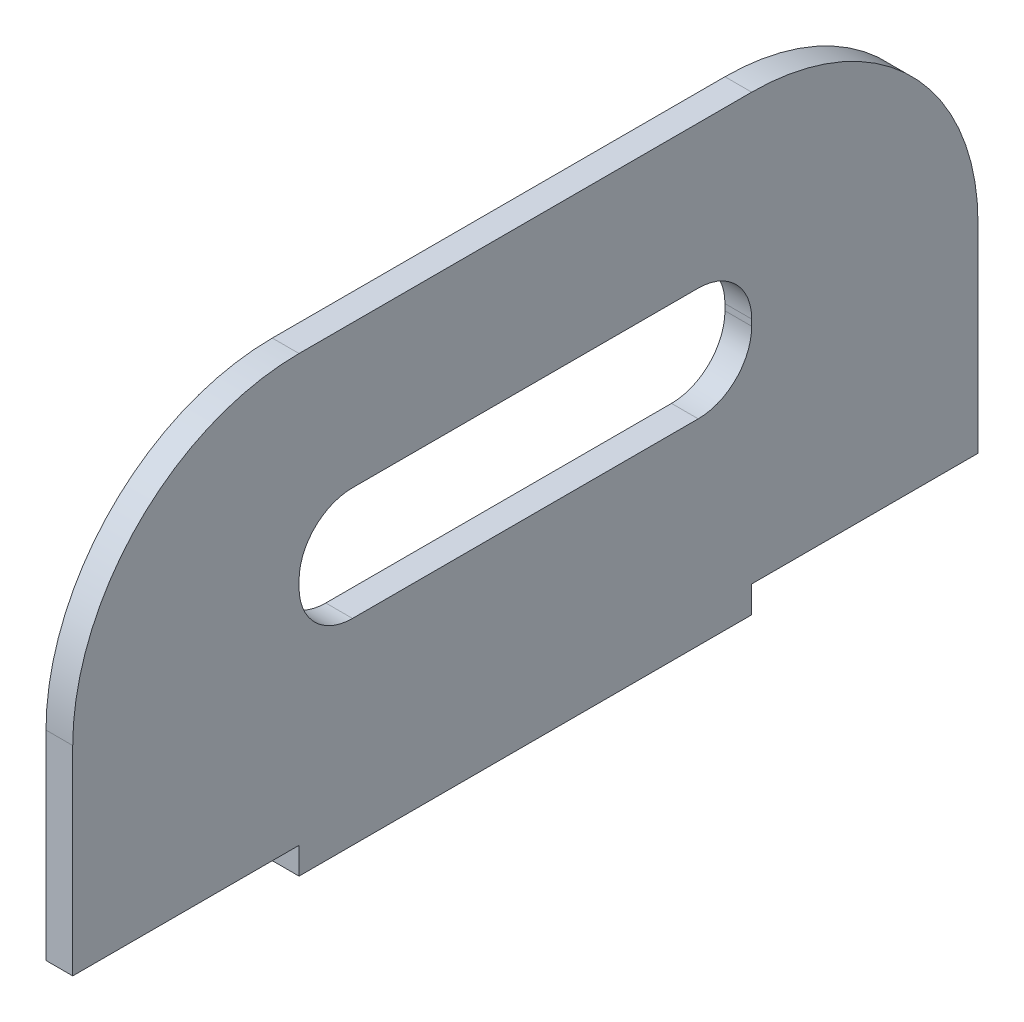
ISO-10303-21;
HEADER;
FILE_DESCRIPTION(('STEP AP214'),'2;1');
FILE_NAME('part.step','',(''),(''),'','','');
FILE_SCHEMA(('AUTOMOTIVE_DESIGN { 1 0 10303 214 1 1 1 1 }'));
ENDSEC;
DATA;
#1=APPLICATION_CONTEXT('core data for automotive mechanical design processes');
#2=APPLICATION_PROTOCOL_DEFINITION('international standard','automotive_design',2000,#1);
#3=PRODUCT_CONTEXT('',#1,'mechanical');
#4=PRODUCT('Part','Part','',(#3));
#5=PRODUCT_RELATED_PRODUCT_CATEGORY('part','',(#4));
#6=PRODUCT_DEFINITION_FORMATION('','',#4);
#7=PRODUCT_DEFINITION_CONTEXT('part definition',#1,'design');
#8=PRODUCT_DEFINITION('design','',#6,#7);
#9=PRODUCT_DEFINITION_SHAPE('','',#8);
#10=(LENGTH_UNIT() NAMED_UNIT(*) SI_UNIT(.MILLI.,.METRE.));
#11=(NAMED_UNIT(*) PLANE_ANGLE_UNIT() SI_UNIT($,.RADIAN.));
#12=(NAMED_UNIT(*) SI_UNIT($,.STERADIAN.) SOLID_ANGLE_UNIT());
#13=UNCERTAINTY_MEASURE_WITH_UNIT(LENGTH_MEASURE(1.E-05),#10,'distance_accuracy_value','');
#14=(GEOMETRIC_REPRESENTATION_CONTEXT(3) GLOBAL_UNCERTAINTY_ASSIGNED_CONTEXT((#13)) GLOBAL_UNIT_ASSIGNED_CONTEXT((#10,
#11,#12)) REPRESENTATION_CONTEXT('',''));
#15=CARTESIAN_POINT('',(0.,0.,0.));
#16=DIRECTION('',(0.,0.,1.));
#17=DIRECTION('',(1.,0.,0.));
#18=AXIS2_PLACEMENT_3D('',#15,#16,#17);
#19=CARTESIAN_POINT('',(3.,0.,0.));
#20=DIRECTION('',(0.,0.,-1.));
#21=DIRECTION('',(-1.,0.,0.));
#22=AXIS2_PLACEMENT_3D('',#19,#20,#21);
#23=PLANE('',#22);
#24=DIRECTION('',(0.,-1.,0.));
#25=VECTOR('',#24,1.);
#26=CARTESIAN_POINT('',(0.,0.,0.));
#27=LINE('',#26,#25);
#28=CARTESIAN_POINT('',(0.,25.4,0.));
#29=VERTEX_POINT('',#28);
#30=CARTESIAN_POINT('',(0.,3.,0.));
#31=VERTEX_POINT('',#30);
#32=EDGE_CURVE('E185',#29,#31,#27,.T.);
#33=ORIENTED_EDGE('',*,*,#32,.T.);
#34=DIRECTION('',(1.,0.,0.));
#35=VECTOR('',#34,1.);
#36=CARTESIAN_POINT('',(0.,3.,0.));
#37=LINE('',#36,#35);
#38=CARTESIAN_POINT('',(3.,3.,0.));
#39=VERTEX_POINT('',#38);
#40=EDGE_CURVE('E190',#31,#39,#37,.T.);
#41=ORIENTED_EDGE('',*,*,#40,.T.);
#42=DIRECTION('',(0.,-1.,0.));
#43=VECTOR('',#42,1.);
#44=CARTESIAN_POINT('',(3.,0.,0.));
#45=LINE('',#44,#43);
#46=CARTESIAN_POINT('',(3.,25.4,0.));
#47=VERTEX_POINT('',#46);
#48=EDGE_CURVE('E196',#47,#39,#45,.T.);
#49=ORIENTED_EDGE('',*,*,#48,.F.);
#50=DIRECTION('',(-1.,0.,0.));
#51=VECTOR('',#50,1.);
#52=CARTESIAN_POINT('',(3.,25.4,0.));
#53=LINE('',#52,#51);
#54=EDGE_CURVE('E215',#47,#29,#53,.T.);
#55=ORIENTED_EDGE('',*,*,#54,.T.);
#56=EDGE_LOOP('',(#33,#41,#49,#55));
#57=FACE_BOUND('',#56,.T.);
#58=ADVANCED_FACE('F33',(#57),#23,.F.);
#59=CARTESIAN_POINT('',(3.,0.,0.));
#60=DIRECTION('',(0.,1.,0.));
#61=DIRECTION('',(0.,0.,1.));
#62=AXIS2_PLACEMENT_3D('',#59,#60,#61);
#63=PLANE('',#62);
#64=DIRECTION('',(0.,0.,-1.));
#65=VECTOR('',#64,1.);
#66=CARTESIAN_POINT('',(3.,0.,0.));
#67=LINE('',#66,#65);
#68=CARTESIAN_POINT('',(3.,0.,-25.4));
#69=VERTEX_POINT('',#68);
#70=CARTESIAN_POINT('',(3.,0.,-76.2));
#71=VERTEX_POINT('',#70);
#72=EDGE_CURVE('E178',#69,#71,#67,.T.);
#73=ORIENTED_EDGE('',*,*,#72,.F.);
#74=DIRECTION('',(1.,0.,0.));
#75=VECTOR('',#74,1.);
#76=CARTESIAN_POINT('',(0.,0.,-25.4));
#77=LINE('',#76,#75);
#78=CARTESIAN_POINT('',(0.,0.,-25.4));
#79=VERTEX_POINT('',#78);
#80=EDGE_CURVE('E162',#79,#69,#77,.T.);
#81=ORIENTED_EDGE('',*,*,#80,.F.);
#82=DIRECTION('',(0.,0.,-1.));
#83=VECTOR('',#82,1.);
#84=CARTESIAN_POINT('',(0.,0.,0.));
#85=LINE('',#84,#83);
#86=CARTESIAN_POINT('',(0.,0.,-76.2));
#87=VERTEX_POINT('',#86);
#88=EDGE_CURVE('E176',#79,#87,#85,.T.);
#89=ORIENTED_EDGE('',*,*,#88,.T.);
#90=DIRECTION('',(1.,0.,0.));
#91=VECTOR('',#90,1.);
#92=CARTESIAN_POINT('',(0.,0.,-76.2));
#93=LINE('',#92,#91);
#94=EDGE_CURVE('E332',#87,#71,#93,.T.);
#95=ORIENTED_EDGE('',*,*,#94,.T.);
#96=EDGE_LOOP('',(#73,#81,#89,#95));
#97=FACE_BOUND('',#96,.T.);
#98=ADVANCED_FACE('F174',(#97),#63,.F.);
#99=CARTESIAN_POINT('',(3.,0.,-101.6));
#100=DIRECTION('',(0.,0.,1.));
#101=DIRECTION('',(1.,0.,0.));
#102=AXIS2_PLACEMENT_3D('',#99,#100,#101);
#103=PLANE('',#102);
#104=DIRECTION('',(0.,1.,0.));
#105=VECTOR('',#104,1.);
#106=CARTESIAN_POINT('',(3.,0.,-101.6));
#107=LINE('',#106,#105);
#108=CARTESIAN_POINT('',(3.,3.,-101.6));
#109=VERTEX_POINT('',#108);
#110=CARTESIAN_POINT('',(3.,25.4,-101.6));
#111=VERTEX_POINT('',#110);
#112=EDGE_CURVE('E352',#109,#111,#107,.T.);
#113=ORIENTED_EDGE('',*,*,#112,.F.);
#114=DIRECTION('',(1.,0.,0.));
#115=VECTOR('',#114,1.);
#116=CARTESIAN_POINT('',(0.,3.,-101.6));
#117=LINE('',#116,#115);
#118=CARTESIAN_POINT('',(0.,3.,-101.6));
#119=VERTEX_POINT('',#118);
#120=EDGE_CURVE('E341',#119,#109,#117,.T.);
#121=ORIENTED_EDGE('',*,*,#120,.F.);
#122=DIRECTION('',(0.,1.,0.));
#123=VECTOR('',#122,1.);
#124=CARTESIAN_POINT('',(0.,0.,-101.6));
#125=LINE('',#124,#123);
#126=CARTESIAN_POINT('',(0.,25.4,-101.6));
#127=VERTEX_POINT('',#126);
#128=EDGE_CURVE('E184',#119,#127,#125,.T.);
#129=ORIENTED_EDGE('',*,*,#128,.T.);
#130=DIRECTION('',(-1.,0.,0.));
#131=VECTOR('',#130,1.);
#132=CARTESIAN_POINT('',(3.,25.4,-101.6));
#133=LINE('',#132,#131);
#134=EDGE_CURVE('E208',#127,#111,#133,.F.);
#135=ORIENTED_EDGE('',*,*,#134,.T.);
#136=EDGE_LOOP('',(#113,#121,#129,#135));
#137=FACE_BOUND('',#136,.T.);
#138=ADVANCED_FACE('F285',(#137),#103,.F.);
#139=CARTESIAN_POINT('',(3.,50.8,0.));
#140=DIRECTION('',(0.,-1.,0.));
#141=DIRECTION('',(0.,0.,-1.));
#142=AXIS2_PLACEMENT_3D('',#139,#140,#141);
#143=PLANE('',#142);
#144=DIRECTION('',(0.,0.,1.));
#145=VECTOR('',#144,1.);
#146=CARTESIAN_POINT('',(3.,50.8,0.));
#147=LINE('',#146,#145);
#148=CARTESIAN_POINT('',(3.,50.8,-76.2));
#149=VERTEX_POINT('',#148);
#150=CARTESIAN_POINT('',(3.,50.8,-25.4));
#151=VERTEX_POINT('',#150);
#152=EDGE_CURVE('E200',#149,#151,#147,.T.);
#153=ORIENTED_EDGE('',*,*,#152,.F.);
#154=DIRECTION('',(-1.,0.,0.));
#155=VECTOR('',#154,1.);
#156=CARTESIAN_POINT('',(3.,50.8,-76.2));
#157=LINE('',#156,#155);
#158=CARTESIAN_POINT('',(0.,50.8,-76.2));
#159=VERTEX_POINT('',#158);
#160=EDGE_CURVE('E199',#149,#159,#157,.T.);
#161=ORIENTED_EDGE('',*,*,#160,.T.);
#162=DIRECTION('',(0.,0.,1.));
#163=VECTOR('',#162,1.);
#164=CARTESIAN_POINT('',(0.,50.8,0.));
#165=LINE('',#164,#163);
#166=CARTESIAN_POINT('',(0.,50.8,-25.4));
#167=VERTEX_POINT('',#166);
#168=EDGE_CURVE('E187',#159,#167,#165,.T.);
#169=ORIENTED_EDGE('',*,*,#168,.T.);
#170=DIRECTION('',(-1.,0.,0.));
#171=VECTOR('',#170,1.);
#172=CARTESIAN_POINT('',(3.,50.8,-25.4));
#173=LINE('',#172,#171);
#174=EDGE_CURVE('E197',#167,#151,#173,.F.);
#175=ORIENTED_EDGE('',*,*,#174,.T.);
#176=EDGE_LOOP('',(#153,#161,#169,#175));
#177=FACE_BOUND('',#176,.T.);
#178=ADVANCED_FACE('F380',(#177),#143,.F.);
#179=CARTESIAN_POINT('',(3.,0.,0.));
#180=DIRECTION('',(-1.,0.,0.));
#181=DIRECTION('',(0.,0.,1.));
#182=AXIS2_PLACEMENT_3D('',#179,#180,#181);
#183=PLANE('',#182);
#184=DIRECTION('',(0.,0.,-1.));
#185=VECTOR('',#184,1.);
#186=CARTESIAN_POINT('',(3.,22.05,-25.4));
#187=LINE('',#186,#185);
#188=CARTESIAN_POINT('',(3.,22.05,-31.4));
#189=VERTEX_POINT('',#188);
#190=CARTESIAN_POINT('',(3.,22.05,-70.2));
#191=VERTEX_POINT('',#190);
#192=EDGE_CURVE('E315',#189,#191,#187,.T.);
#193=ORIENTED_EDGE('',*,*,#192,.F.);
#194=CARTESIAN_POINT('',(3.,28.05,-31.4));
#195=DIRECTION('',(-1.,0.,0.));
#196=DIRECTION('',(0.,0.,1.));
#197=AXIS2_PLACEMENT_3D('',#194,#195,#196);
#198=CIRCLE('',#197,6.);
#199=CARTESIAN_POINT('',(3.,28.05,-25.4));
#200=VERTEX_POINT('',#199);
#201=EDGE_CURVE('E249',#189,#200,#198,.T.);
#202=ORIENTED_EDGE('',*,*,#201,.T.);
#203=DIRECTION('',(0.,-1.,0.));
#204=VECTOR('',#203,1.);
#205=CARTESIAN_POINT('',(3.,22.05,-25.4));
#206=LINE('',#205,#204);
#207=CARTESIAN_POINT('',(3.,28.75,-25.4));
#208=VERTEX_POINT('',#207);
#209=EDGE_CURVE('E325',#208,#200,#206,.T.);
#210=ORIENTED_EDGE('',*,*,#209,.F.);
#211=CARTESIAN_POINT('',(3.,28.75,-31.4));
#212=DIRECTION('',(-1.,0.,0.));
#213=DIRECTION('',(0.,0.,1.));
#214=AXIS2_PLACEMENT_3D('',#211,#212,#213);
#215=CIRCLE('',#214,6.);
#216=CARTESIAN_POINT('',(3.,34.75,-31.4));
#217=VERTEX_POINT('',#216);
#218=EDGE_CURVE('E41',#208,#217,#215,.T.);
#219=ORIENTED_EDGE('',*,*,#218,.T.);
#220=DIRECTION('',(0.,0.,1.));
#221=VECTOR('',#220,1.);
#222=CARTESIAN_POINT('',(3.,34.75,-25.4));
#223=LINE('',#222,#221);
#224=CARTESIAN_POINT('',(3.,34.75,-70.2));
#225=VERTEX_POINT('',#224);
#226=EDGE_CURVE('E321',#225,#217,#223,.T.);
#227=ORIENTED_EDGE('',*,*,#226,.F.);
#228=CARTESIAN_POINT('',(3.,28.75,-70.2));
#229=DIRECTION('',(-1.,0.,0.));
#230=DIRECTION('',(0.,0.,1.));
#231=AXIS2_PLACEMENT_3D('',#228,#229,#230);
#232=CIRCLE('',#231,6.);
#233=CARTESIAN_POINT('',(3.,28.75,-76.2));
#234=VERTEX_POINT('',#233);
#235=EDGE_CURVE('E55',#225,#234,#232,.T.);
#236=ORIENTED_EDGE('',*,*,#235,.T.);
#237=DIRECTION('',(0.,1.,0.));
#238=VECTOR('',#237,1.);
#239=CARTESIAN_POINT('',(3.,22.05,-76.2));
#240=LINE('',#239,#238);
#241=CARTESIAN_POINT('',(3.,28.05,-76.2));
#242=VERTEX_POINT('',#241);
#243=EDGE_CURVE('E320',#242,#234,#240,.T.);
#244=ORIENTED_EDGE('',*,*,#243,.F.);
#245=CARTESIAN_POINT('',(3.,28.05,-70.2));
#246=DIRECTION('',(-1.,0.,0.));
#247=DIRECTION('',(0.,0.,1.));
#248=AXIS2_PLACEMENT_3D('',#245,#246,#247);
#249=CIRCLE('',#248,6.);
#250=EDGE_CURVE('E253',#242,#191,#249,.T.);
#251=ORIENTED_EDGE('',*,*,#250,.T.);
#252=EDGE_LOOP('',(#193,#202,#210,#219,#227,#236,#244,#251));
#253=FACE_BOUND('',#252,.T.);
#254=ORIENTED_EDGE('',*,*,#48,.T.);
#255=DIRECTION('',(0.,0.,1.));
#256=VECTOR('',#255,1.);
#257=CARTESIAN_POINT('',(3.,3.,0.));
#258=LINE('',#257,#256);
#259=CARTESIAN_POINT('',(3.,3.,-25.4));
#260=VERTEX_POINT('',#259);
#261=EDGE_CURVE('E169',#260,#39,#258,.T.);
#262=ORIENTED_EDGE('',*,*,#261,.F.);
#263=DIRECTION('',(0.,1.,0.));
#264=VECTOR('',#263,1.);
#265=CARTESIAN_POINT('',(3.,0.,-25.4));
#266=LINE('',#265,#264);
#267=EDGE_CURVE('E330',#69,#260,#266,.T.);
#268=ORIENTED_EDGE('',*,*,#267,.F.);
#269=ORIENTED_EDGE('',*,*,#72,.T.);
#270=DIRECTION('',(0.,-1.,0.));
#271=VECTOR('',#270,1.);
#272=CARTESIAN_POINT('',(3.,0.,-76.2));
#273=LINE('',#272,#271);
#274=CARTESIAN_POINT('',(3.,3.,-76.2));
#275=VERTEX_POINT('',#274);
#276=EDGE_CURVE('E339',#275,#71,#273,.T.);
#277=ORIENTED_EDGE('',*,*,#276,.F.);
#278=DIRECTION('',(0.,0.,1.));
#279=VECTOR('',#278,1.);
#280=CARTESIAN_POINT('',(3.,3.,-101.6));
#281=LINE('',#280,#279);
#282=EDGE_CURVE('E323',#109,#275,#281,.T.);
#283=ORIENTED_EDGE('',*,*,#282,.F.);
#284=ORIENTED_EDGE('',*,*,#112,.T.);
#285=CARTESIAN_POINT('',(3.,25.4,-76.2));
#286=DIRECTION('',(-1.,0.,0.));
#287=DIRECTION('',(0.,0.,1.));
#288=AXIS2_PLACEMENT_3D('',#285,#286,#287);
#289=CIRCLE('',#288,25.4);
#290=EDGE_CURVE('E213',#111,#149,#289,.F.);
#291=ORIENTED_EDGE('',*,*,#290,.T.);
#292=ORIENTED_EDGE('',*,*,#152,.T.);
#293=CARTESIAN_POINT('',(3.,25.4,-25.4));
#294=DIRECTION('',(-1.,0.,0.));
#295=DIRECTION('',(0.,0.,1.));
#296=AXIS2_PLACEMENT_3D('',#293,#294,#295);
#297=CIRCLE('',#296,25.4);
#298=EDGE_CURVE('E211',#151,#47,#297,.F.);
#299=ORIENTED_EDGE('',*,*,#298,.T.);
#300=EDGE_LOOP('',(#254,#262,#268,#269,#277,#283,#284,#291,#292,#299));
#301=FACE_BOUND('',#300,.T.);
#302=ADVANCED_FACE('F357',(#253,#301),#183,.F.);
#303=CARTESIAN_POINT('',(0.,0.,0.));
#304=DIRECTION('',(-1.,0.,0.));
#305=DIRECTION('',(0.,0.,1.));
#306=AXIS2_PLACEMENT_3D('',#303,#304,#305);
#307=PLANE('',#306);
#308=DIRECTION('',(0.,1.,0.));
#309=VECTOR('',#308,1.);
#310=CARTESIAN_POINT('',(0.,0.,-25.4));
#311=LINE('',#310,#309);
#312=CARTESIAN_POINT('',(0.,28.05,-25.4));
#313=VERTEX_POINT('',#312);
#314=CARTESIAN_POINT('',(0.,28.75,-25.4));
#315=VERTEX_POINT('',#314);
#316=EDGE_CURVE('E227',#313,#315,#311,.T.);
#317=ORIENTED_EDGE('',*,*,#316,.F.);
#318=CARTESIAN_POINT('',(0.,28.05,-31.4));
#319=DIRECTION('',(-1.,0.,0.));
#320=DIRECTION('',(0.,0.,1.));
#321=AXIS2_PLACEMENT_3D('',#318,#319,#320);
#322=CIRCLE('',#321,6.);
#323=CARTESIAN_POINT('',(0.,22.05,-31.4));
#324=VERTEX_POINT('',#323);
#325=EDGE_CURVE('E251',#313,#324,#322,.F.);
#326=ORIENTED_EDGE('',*,*,#325,.T.);
#327=DIRECTION('',(0.,0.,1.));
#328=VECTOR('',#327,1.);
#329=CARTESIAN_POINT('',(0.,22.05,0.));
#330=LINE('',#329,#328);
#331=CARTESIAN_POINT('',(0.,22.05,-70.2));
#332=VERTEX_POINT('',#331);
#333=EDGE_CURVE('E218',#332,#324,#330,.T.);
#334=ORIENTED_EDGE('',*,*,#333,.F.);
#335=CARTESIAN_POINT('',(0.,28.05,-70.2));
#336=DIRECTION('',(-1.,0.,0.));
#337=DIRECTION('',(0.,0.,1.));
#338=AXIS2_PLACEMENT_3D('',#335,#336,#337);
#339=CIRCLE('',#338,6.);
#340=CARTESIAN_POINT('',(0.,28.05,-76.2));
#341=VERTEX_POINT('',#340);
#342=EDGE_CURVE('E255',#332,#341,#339,.F.);
#343=ORIENTED_EDGE('',*,*,#342,.T.);
#344=DIRECTION('',(0.,-1.,0.));
#345=VECTOR('',#344,1.);
#346=CARTESIAN_POINT('',(0.,0.,-76.2));
#347=LINE('',#346,#345);
#348=CARTESIAN_POINT('',(0.,28.75,-76.2));
#349=VERTEX_POINT('',#348);
#350=EDGE_CURVE('E221',#349,#341,#347,.T.);
#351=ORIENTED_EDGE('',*,*,#350,.F.);
#352=CARTESIAN_POINT('',(0.,28.75,-70.2));
#353=DIRECTION('',(-1.,0.,0.));
#354=DIRECTION('',(0.,0.,1.));
#355=AXIS2_PLACEMENT_3D('',#352,#353,#354);
#356=CIRCLE('',#355,6.);
#357=CARTESIAN_POINT('',(0.,34.75,-70.2));
#358=VERTEX_POINT('',#357);
#359=EDGE_CURVE('E258',#349,#358,#356,.F.);
#360=ORIENTED_EDGE('',*,*,#359,.T.);
#361=DIRECTION('',(0.,0.,-1.));
#362=VECTOR('',#361,1.);
#363=CARTESIAN_POINT('',(0.,34.75,0.));
#364=LINE('',#363,#362);
#365=CARTESIAN_POINT('',(0.,34.75,-31.4));
#366=VERTEX_POINT('',#365);
#367=EDGE_CURVE('E224',#366,#358,#364,.T.);
#368=ORIENTED_EDGE('',*,*,#367,.F.);
#369=CARTESIAN_POINT('',(0.,28.75,-31.4));
#370=DIRECTION('',(-1.,0.,0.));
#371=DIRECTION('',(0.,0.,1.));
#372=AXIS2_PLACEMENT_3D('',#369,#370,#371);
#373=CIRCLE('',#372,6.);
#374=EDGE_CURVE('E11',#366,#315,#373,.F.);
#375=ORIENTED_EDGE('',*,*,#374,.T.);
#376=EDGE_LOOP('',(#317,#326,#334,#343,#351,#360,#368,#375));
#377=FACE_BOUND('',#376,.T.);
#378=DIRECTION('',(0.,0.,1.));
#379=VECTOR('',#378,1.);
#380=CARTESIAN_POINT('',(0.,3.,0.));
#381=LINE('',#380,#379);
#382=CARTESIAN_POINT('',(0.,3.,-25.4));
#383=VERTEX_POINT('',#382);
#384=EDGE_CURVE('E168',#383,#31,#381,.T.);
#385=ORIENTED_EDGE('',*,*,#384,.T.);
#386=ORIENTED_EDGE('',*,*,#32,.F.);
#387=CARTESIAN_POINT('',(0.,25.4,-25.4));
#388=DIRECTION('',(-1.,0.,0.));
#389=DIRECTION('',(0.,0.,1.));
#390=AXIS2_PLACEMENT_3D('',#387,#388,#389);
#391=CIRCLE('',#390,25.4);
#392=EDGE_CURVE('E203',#29,#167,#391,.T.);
#393=ORIENTED_EDGE('',*,*,#392,.T.);
#394=ORIENTED_EDGE('',*,*,#168,.F.);
#395=CARTESIAN_POINT('',(0.,25.4,-76.2));
#396=DIRECTION('',(-1.,0.,0.));
#397=DIRECTION('',(0.,0.,1.));
#398=AXIS2_PLACEMENT_3D('',#395,#396,#397);
#399=CIRCLE('',#398,25.4);
#400=EDGE_CURVE('E205',#159,#127,#399,.T.);
#401=ORIENTED_EDGE('',*,*,#400,.T.);
#402=ORIENTED_EDGE('',*,*,#128,.F.);
#403=DIRECTION('',(0.,0.,1.));
#404=VECTOR('',#403,1.);
#405=CARTESIAN_POINT('',(0.,3.,-101.6));
#406=LINE('',#405,#404);
#407=CARTESIAN_POINT('',(0.,3.,-76.2));
#408=VERTEX_POINT('',#407);
#409=EDGE_CURVE('E337',#119,#408,#406,.T.);
#410=ORIENTED_EDGE('',*,*,#409,.T.);
#411=DIRECTION('',(0.,-1.,0.));
#412=VECTOR('',#411,1.);
#413=CARTESIAN_POINT('',(0.,0.,-76.2));
#414=LINE('',#413,#412);
#415=EDGE_CURVE('E183',#408,#87,#414,.T.);
#416=ORIENTED_EDGE('',*,*,#415,.T.);
#417=ORIENTED_EDGE('',*,*,#88,.F.);
#418=DIRECTION('',(0.,1.,0.));
#419=VECTOR('',#418,1.);
#420=CARTESIAN_POINT('',(0.,0.,-25.4));
#421=LINE('',#420,#419);
#422=EDGE_CURVE('E158',#79,#383,#421,.T.);
#423=ORIENTED_EDGE('',*,*,#422,.T.);
#424=EDGE_LOOP('',(#385,#386,#393,#394,#401,#402,#410,#416,#417,#423));
#425=FACE_BOUND('',#424,.T.);
#426=ADVANCED_FACE('F181',(#377,#425),#307,.T.);
#427=CARTESIAN_POINT('',(3.,25.4,-76.2));
#428=DIRECTION('',(-1.,0.,0.));
#429=DIRECTION('',(0.,0.,1.));
#430=AXIS2_PLACEMENT_3D('',#427,#428,#429);
#431=CYLINDRICAL_SURFACE('',#430,25.4);
#432=ORIENTED_EDGE('',*,*,#290,.F.);
#433=ORIENTED_EDGE('',*,*,#134,.F.);
#434=ORIENTED_EDGE('',*,*,#400,.F.);
#435=ORIENTED_EDGE('',*,*,#160,.F.);
#436=EDGE_LOOP('',(#432,#433,#434,#435));
#437=FACE_BOUND('',#436,.T.);
#438=ADVANCED_FACE('F289',(#437),#431,.T.);
#439=CARTESIAN_POINT('',(3.,25.4,-25.4));
#440=DIRECTION('',(-1.,0.,0.));
#441=DIRECTION('',(0.,0.,1.));
#442=AXIS2_PLACEMENT_3D('',#439,#440,#441);
#443=CYLINDRICAL_SURFACE('',#442,25.4);
#444=ORIENTED_EDGE('',*,*,#298,.F.);
#445=ORIENTED_EDGE('',*,*,#174,.F.);
#446=ORIENTED_EDGE('',*,*,#392,.F.);
#447=ORIENTED_EDGE('',*,*,#54,.F.);
#448=EDGE_LOOP('',(#444,#445,#446,#447));
#449=FACE_BOUND('',#448,.T.);
#450=ADVANCED_FACE('F292',(#449),#443,.T.);
#451=CARTESIAN_POINT('',(0.,0.,-76.2));
#452=DIRECTION('',(0.,0.,1.));
#453=DIRECTION('',(1.,0.,0.));
#454=AXIS2_PLACEMENT_3D('',#451,#452,#453);
#455=PLANE('',#454);
#456=ORIENTED_EDGE('',*,*,#276,.T.);
#457=ORIENTED_EDGE('',*,*,#94,.F.);
#458=ORIENTED_EDGE('',*,*,#415,.F.);
#459=DIRECTION('',(1.,0.,0.));
#460=VECTOR('',#459,1.);
#461=CARTESIAN_POINT('',(0.,3.,-76.2));
#462=LINE('',#461,#460);
#463=EDGE_CURVE('E346',#408,#275,#462,.T.);
#464=ORIENTED_EDGE('',*,*,#463,.T.);
#465=EDGE_LOOP('',(#456,#457,#458,#464));
#466=FACE_BOUND('',#465,.T.);
#467=ADVANCED_FACE('F296',(#466),#455,.F.);
#468=CARTESIAN_POINT('',(0.,3.,-101.6));
#469=DIRECTION('',(0.,1.,0.));
#470=DIRECTION('',(0.,0.,1.));
#471=AXIS2_PLACEMENT_3D('',#468,#469,#470);
#472=PLANE('',#471);
#473=ORIENTED_EDGE('',*,*,#282,.T.);
#474=ORIENTED_EDGE('',*,*,#463,.F.);
#475=ORIENTED_EDGE('',*,*,#409,.F.);
#476=ORIENTED_EDGE('',*,*,#120,.T.);
#477=EDGE_LOOP('',(#473,#474,#475,#476));
#478=FACE_BOUND('',#477,.T.);
#479=ADVANCED_FACE('F375',(#478),#472,.F.);
#480=CARTESIAN_POINT('',(0.,3.,0.));
#481=DIRECTION('',(0.,1.,0.));
#482=DIRECTION('',(0.,0.,1.));
#483=AXIS2_PLACEMENT_3D('',#480,#481,#482);
#484=PLANE('',#483);
#485=ORIENTED_EDGE('',*,*,#261,.T.);
#486=ORIENTED_EDGE('',*,*,#40,.F.);
#487=ORIENTED_EDGE('',*,*,#384,.F.);
#488=DIRECTION('',(1.,0.,0.));
#489=VECTOR('',#488,1.);
#490=CARTESIAN_POINT('',(0.,3.,-25.4));
#491=LINE('',#490,#489);
#492=EDGE_CURVE('E164',#383,#260,#491,.T.);
#493=ORIENTED_EDGE('',*,*,#492,.T.);
#494=EDGE_LOOP('',(#485,#486,#487,#493));
#495=FACE_BOUND('',#494,.T.);
#496=ADVANCED_FACE('F367',(#495),#484,.F.);
#497=CARTESIAN_POINT('',(0.,0.,-25.4));
#498=DIRECTION('',(0.,0.,-1.));
#499=DIRECTION('',(-1.,0.,0.));
#500=AXIS2_PLACEMENT_3D('',#497,#498,#499);
#501=PLANE('',#500);
#502=ORIENTED_EDGE('',*,*,#267,.T.);
#503=ORIENTED_EDGE('',*,*,#492,.F.);
#504=ORIENTED_EDGE('',*,*,#422,.F.);
#505=ORIENTED_EDGE('',*,*,#80,.T.);
#506=EDGE_LOOP('',(#502,#503,#504,#505));
#507=FACE_BOUND('',#506,.T.);
#508=ADVANCED_FACE('F161',(#507),#501,.F.);
#509=CARTESIAN_POINT('',(-7.,22.05,-25.4));
#510=DIRECTION('',(0.,0.,1.));
#511=DIRECTION('',(1.,0.,0.));
#512=AXIS2_PLACEMENT_3D('',#509,#510,#511);
#513=PLANE('',#512);
#514=ORIENTED_EDGE('',*,*,#209,.T.);
#515=DIRECTION('',(1.,0.,0.));
#516=VECTOR('',#515,1.);
#517=CARTESIAN_POINT('',(0.,28.05,-25.4));
#518=LINE('',#517,#516);
#519=EDGE_CURVE('E238',#200,#313,#518,.F.);
#520=ORIENTED_EDGE('',*,*,#519,.T.);
#521=ORIENTED_EDGE('',*,*,#316,.T.);
#522=DIRECTION('',(1.,0.,0.));
#523=VECTOR('',#522,1.);
#524=CARTESIAN_POINT('',(3.,28.75,-25.4));
#525=LINE('',#524,#523);
#526=EDGE_CURVE('E235',#315,#208,#525,.T.);
#527=ORIENTED_EDGE('',*,*,#526,.T.);
#528=EDGE_LOOP('',(#514,#520,#521,#527));
#529=FACE_BOUND('',#528,.T.);
#530=ADVANCED_FACE('F398',(#529),#513,.F.);
#531=CARTESIAN_POINT('',(-7.,34.75,-25.4));
#532=DIRECTION('',(0.,1.,0.));
#533=DIRECTION('',(0.,0.,1.));
#534=AXIS2_PLACEMENT_3D('',#531,#532,#533);
#535=PLANE('',#534);
#536=ORIENTED_EDGE('',*,*,#367,.T.);
#537=DIRECTION('',(1.,0.,0.));
#538=VECTOR('',#537,1.);
#539=CARTESIAN_POINT('',(3.,34.75,-70.2));
#540=LINE('',#539,#538);
#541=EDGE_CURVE('E247',#358,#225,#540,.T.);
#542=ORIENTED_EDGE('',*,*,#541,.T.);
#543=ORIENTED_EDGE('',*,*,#226,.T.);
#544=DIRECTION('',(1.,0.,0.));
#545=VECTOR('',#544,1.);
#546=CARTESIAN_POINT('',(0.,34.75,-31.4));
#547=LINE('',#546,#545);
#548=EDGE_CURVE('E245',#217,#366,#547,.F.);
#549=ORIENTED_EDGE('',*,*,#548,.T.);
#550=EDGE_LOOP('',(#536,#542,#543,#549));
#551=FACE_BOUND('',#550,.T.);
#552=ADVANCED_FACE('F266',(#551),#535,.F.);
#553=CARTESIAN_POINT('',(-7.,22.05,-76.2));
#554=DIRECTION('',(0.,0.,-1.));
#555=DIRECTION('',(0.,1.,0.));
#556=AXIS2_PLACEMENT_3D('',#553,#554,#555);
#557=PLANE('',#556);
#558=ORIENTED_EDGE('',*,*,#350,.T.);
#559=DIRECTION('',(1.,0.,0.));
#560=VECTOR('',#559,1.);
#561=CARTESIAN_POINT('',(3.,28.05,-76.2));
#562=LINE('',#561,#560);
#563=EDGE_CURVE('E242',#341,#242,#562,.T.);
#564=ORIENTED_EDGE('',*,*,#563,.T.);
#565=ORIENTED_EDGE('',*,*,#243,.T.);
#566=DIRECTION('',(1.,0.,0.));
#567=VECTOR('',#566,1.);
#568=CARTESIAN_POINT('',(0.,28.75,-76.2));
#569=LINE('',#568,#567);
#570=EDGE_CURVE('E240',#234,#349,#569,.F.);
#571=ORIENTED_EDGE('',*,*,#570,.T.);
#572=EDGE_LOOP('',(#558,#564,#565,#571));
#573=FACE_BOUND('',#572,.T.);
#574=ADVANCED_FACE('F304',(#573),#557,.F.);
#575=CARTESIAN_POINT('',(-7.,22.05,-25.4));
#576=DIRECTION('',(0.,-1.,0.));
#577=DIRECTION('',(0.,0.,-1.));
#578=AXIS2_PLACEMENT_3D('',#575,#576,#577);
#579=PLANE('',#578);
#580=ORIENTED_EDGE('',*,*,#333,.T.);
#581=DIRECTION('',(1.,0.,0.));
#582=VECTOR('',#581,1.);
#583=CARTESIAN_POINT('',(3.,22.05,-31.4));
#584=LINE('',#583,#582);
#585=EDGE_CURVE('E232',#324,#189,#584,.T.);
#586=ORIENTED_EDGE('',*,*,#585,.T.);
#587=ORIENTED_EDGE('',*,*,#192,.T.);
#588=DIRECTION('',(1.,0.,0.));
#589=VECTOR('',#588,1.);
#590=CARTESIAN_POINT('',(0.,22.05,-70.2));
#591=LINE('',#590,#589);
#592=EDGE_CURVE('E230',#191,#332,#591,.F.);
#593=ORIENTED_EDGE('',*,*,#592,.T.);
#594=EDGE_LOOP('',(#580,#586,#587,#593));
#595=FACE_BOUND('',#594,.T.);
#596=ADVANCED_FACE('F299',(#595),#579,.F.);
#597=CARTESIAN_POINT('',(-7.,28.05,-31.4));
#598=DIRECTION('',(-1.,0.,0.));
#599=DIRECTION('',(0.,0.,1.));
#600=AXIS2_PLACEMENT_3D('',#597,#598,#599);
#601=CYLINDRICAL_SURFACE('',#600,6.);
#602=ORIENTED_EDGE('',*,*,#325,.F.);
#603=ORIENTED_EDGE('',*,*,#519,.F.);
#604=ORIENTED_EDGE('',*,*,#201,.F.);
#605=ORIENTED_EDGE('',*,*,#585,.F.);
#606=EDGE_LOOP('',(#602,#603,#604,#605));
#607=FACE_BOUND('',#606,.T.);
#608=ADVANCED_FACE('F276',(#607),#601,.F.);
#609=CARTESIAN_POINT('',(-7.,28.05,-70.2));
#610=DIRECTION('',(-1.,0.,0.));
#611=DIRECTION('',(0.,0.,1.));
#612=AXIS2_PLACEMENT_3D('',#609,#610,#611);
#613=CYLINDRICAL_SURFACE('',#612,6.);
#614=ORIENTED_EDGE('',*,*,#342,.F.);
#615=ORIENTED_EDGE('',*,*,#592,.F.);
#616=ORIENTED_EDGE('',*,*,#250,.F.);
#617=ORIENTED_EDGE('',*,*,#563,.F.);
#618=EDGE_LOOP('',(#614,#615,#616,#617));
#619=FACE_BOUND('',#618,.T.);
#620=ADVANCED_FACE('F270',(#619),#613,.F.);
#621=CARTESIAN_POINT('',(-7.,28.75,-70.2));
#622=DIRECTION('',(-1.,0.,0.));
#623=DIRECTION('',(0.,0.,1.));
#624=AXIS2_PLACEMENT_3D('',#621,#622,#623);
#625=CYLINDRICAL_SURFACE('',#624,6.);
#626=ORIENTED_EDGE('',*,*,#359,.F.);
#627=ORIENTED_EDGE('',*,*,#570,.F.);
#628=ORIENTED_EDGE('',*,*,#235,.F.);
#629=ORIENTED_EDGE('',*,*,#541,.F.);
#630=EDGE_LOOP('',(#626,#627,#628,#629));
#631=FACE_BOUND('',#630,.T.);
#632=ADVANCED_FACE('F268',(#631),#625,.F.);
#633=CARTESIAN_POINT('',(-7.,28.75,-31.4));
#634=DIRECTION('',(-1.,0.,0.));
#635=DIRECTION('',(0.,0.,1.));
#636=AXIS2_PLACEMENT_3D('',#633,#634,#635);
#637=CYLINDRICAL_SURFACE('',#636,6.);
#638=ORIENTED_EDGE('',*,*,#374,.F.);
#639=ORIENTED_EDGE('',*,*,#548,.F.);
#640=ORIENTED_EDGE('',*,*,#218,.F.);
#641=ORIENTED_EDGE('',*,*,#526,.F.);
#642=EDGE_LOOP('',(#638,#639,#640,#641));
#643=FACE_BOUND('',#642,.T.);
#644=ADVANCED_FACE('F35',(#643),#637,.F.);
#645=CLOSED_SHELL('',(#58,#98,#138,#178,#302,#426,#438,#450,#467,#479,#496,#508,#530,#552,#574,
#596,#608,#620,#632,#644));
#646=MANIFOLD_SOLID_BREP('B2',#645);
#647=ADVANCED_BREP_SHAPE_REPRESENTATION('',(#18,#646),#14);
#648=SHAPE_DEFINITION_REPRESENTATION(#9,#647);
ENDSEC;
END-ISO-10303-21;
